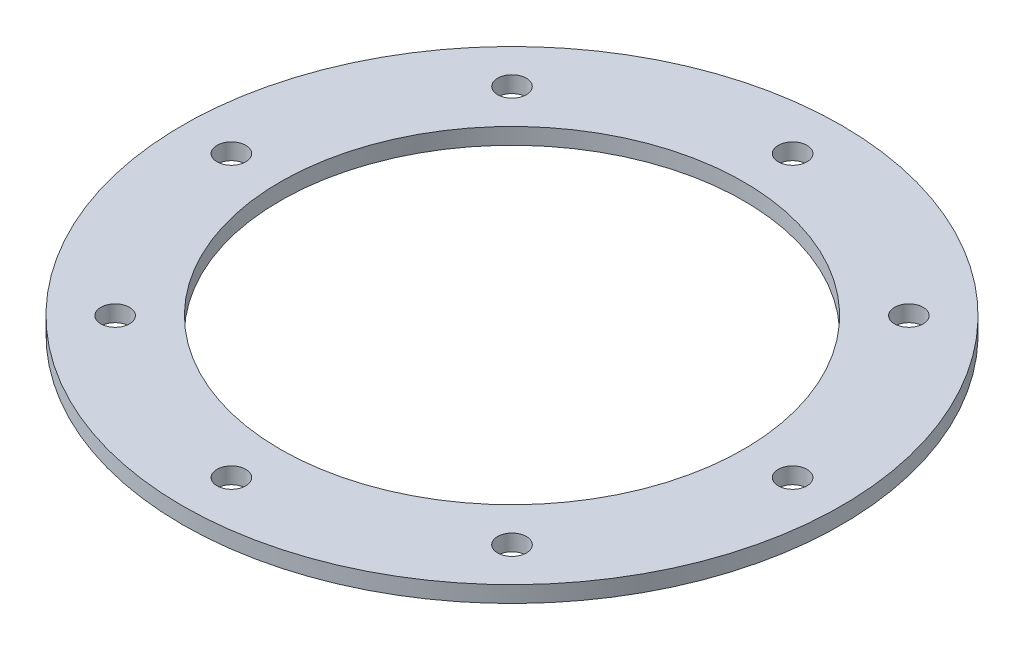
ISO-10303-21;
HEADER;
FILE_DESCRIPTION(('STEP AP214'),'2;1');
FILE_NAME('part.step','',(''),(''),'','','');
FILE_SCHEMA(('AUTOMOTIVE_DESIGN { 1 0 10303 214 1 1 1 1 }'));
ENDSEC;
DATA;
#1=APPLICATION_CONTEXT('core data for automotive mechanical design processes');
#2=APPLICATION_PROTOCOL_DEFINITION('international standard','automotive_design',2000,#1);
#3=PRODUCT_CONTEXT('',#1,'mechanical');
#4=PRODUCT('Part','Part','',(#3));
#5=PRODUCT_RELATED_PRODUCT_CATEGORY('part','',(#4));
#6=PRODUCT_DEFINITION_FORMATION('','',#4);
#7=PRODUCT_DEFINITION_CONTEXT('part definition',#1,'design');
#8=PRODUCT_DEFINITION('design','',#6,#7);
#9=PRODUCT_DEFINITION_SHAPE('','',#8);
#10=(LENGTH_UNIT() NAMED_UNIT(*) SI_UNIT(.MILLI.,.METRE.));
#11=(NAMED_UNIT(*) PLANE_ANGLE_UNIT() SI_UNIT($,.RADIAN.));
#12=(NAMED_UNIT(*) SI_UNIT($,.STERADIAN.) SOLID_ANGLE_UNIT());
#13=UNCERTAINTY_MEASURE_WITH_UNIT(LENGTH_MEASURE(1.E-05),#10,'distance_accuracy_value','');
#14=(GEOMETRIC_REPRESENTATION_CONTEXT(3) GLOBAL_UNCERTAINTY_ASSIGNED_CONTEXT((#13)) GLOBAL_UNIT_ASSIGNED_CONTEXT((#10,
#11,#12)) REPRESENTATION_CONTEXT('',''));
#15=CARTESIAN_POINT('',(0.,0.,0.));
#16=DIRECTION('',(0.,0.,1.));
#17=DIRECTION('',(1.,0.,0.));
#18=AXIS2_PLACEMENT_3D('',#15,#16,#17);
#19=CARTESIAN_POINT('',(0.,5.,0.));
#20=DIRECTION('',(0.,1.,0.));
#21=DIRECTION('',(0.,0.,1.));
#22=AXIS2_PLACEMENT_3D('',#19,#20,#21);
#23=PLANE('',#22);
#24=CARTESIAN_POINT('',(0.,5.,-86.));
#25=DIRECTION('',(0.,1.,0.));
#26=DIRECTION('',(0.,0.,1.));
#27=AXIS2_PLACEMENT_3D('',#24,#25,#26);
#28=CIRCLE('',#27,4.4);
#29=CARTESIAN_POINT('',(0.,5.,-81.6));
#30=VERTEX_POINT('',#29);
#31=EDGE_CURVE('E92',#30,#30,#28,.T.);
#32=ORIENTED_EDGE('',*,*,#31,.F.);
#33=EDGE_LOOP('',(#32));
#34=FACE_BOUND('',#33,.T.);
#35=CARTESIAN_POINT('',(-86.,5.,0.));
#36=DIRECTION('',(0.,1.,0.));
#37=DIRECTION('',(0.,0.,1.));
#38=AXIS2_PLACEMENT_3D('',#35,#36,#37);
#39=CIRCLE('',#38,4.4);
#40=CARTESIAN_POINT('',(-86.,5.,4.39999999999999));
#41=VERTEX_POINT('',#40);
#42=EDGE_CURVE('E79',#41,#41,#39,.T.);
#43=ORIENTED_EDGE('',*,*,#42,.F.);
#44=EDGE_LOOP('',(#43));
#45=FACE_BOUND('',#44,.T.);
#46=CARTESIAN_POINT('',(0.,5.,86.));
#47=DIRECTION('',(0.,1.,0.));
#48=DIRECTION('',(0.,0.,1.));
#49=AXIS2_PLACEMENT_3D('',#46,#47,#48);
#50=CIRCLE('',#49,4.4);
#51=CARTESIAN_POINT('',(0.,5.,90.4));
#52=VERTEX_POINT('',#51);
#53=EDGE_CURVE('E70',#52,#52,#50,.T.);
#54=ORIENTED_EDGE('',*,*,#53,.F.);
#55=EDGE_LOOP('',(#54));
#56=FACE_BOUND('',#55,.T.);
#57=CARTESIAN_POINT('',(86.,5.,0.));
#58=DIRECTION('',(0.,1.,0.));
#59=DIRECTION('',(0.,0.,1.));
#60=AXIS2_PLACEMENT_3D('',#57,#58,#59);
#61=CIRCLE('',#60,4.4);
#62=CARTESIAN_POINT('',(86.,5.,4.4));
#63=VERTEX_POINT('',#62);
#64=EDGE_CURVE('E54',#63,#63,#61,.T.);
#65=ORIENTED_EDGE('',*,*,#64,.F.);
#66=EDGE_LOOP('',(#65));
#67=FACE_BOUND('',#66,.T.);
#68=CARTESIAN_POINT('',(0.,5.,0.));
#69=DIRECTION('',(0.,1.,0.));
#70=DIRECTION('',(0.,0.,1.));
#71=AXIS2_PLACEMENT_3D('',#68,#69,#70);
#72=CIRCLE('',#71,101.);
#73=CARTESIAN_POINT('',(0.,5.,101.));
#74=VERTEX_POINT('',#73);
#75=EDGE_CURVE('E10',#74,#74,#72,.T.);
#76=ORIENTED_EDGE('',*,*,#75,.T.);
#77=EDGE_LOOP('',(#76));
#78=FACE_BOUND('',#77,.T.);
#79=CARTESIAN_POINT('',(0.,5.,0.));
#80=DIRECTION('',(0.,1.,0.));
#81=DIRECTION('',(0.,0.,1.));
#82=AXIS2_PLACEMENT_3D('',#79,#80,#81);
#83=CIRCLE('',#82,71.);
#84=CARTESIAN_POINT('',(0.,5.,71.));
#85=VERTEX_POINT('',#84);
#86=EDGE_CURVE('E49',#85,#85,#83,.T.);
#87=ORIENTED_EDGE('',*,*,#86,.F.);
#88=EDGE_LOOP('',(#87));
#89=FACE_BOUND('',#88,.T.);
#90=CARTESIAN_POINT('',(60.8111831820431,5.,60.8111831820431));
#91=DIRECTION('',(0.,1.,0.));
#92=DIRECTION('',(0.,0.,1.));
#93=AXIS2_PLACEMENT_3D('',#90,#91,#92);
#94=CIRCLE('',#93,4.39999999999998);
#95=CARTESIAN_POINT('',(60.8111831820431,5.,65.2111831820431));
#96=VERTEX_POINT('',#95);
#97=EDGE_CURVE('E62',#96,#96,#94,.T.);
#98=ORIENTED_EDGE('',*,*,#97,.F.);
#99=EDGE_LOOP('',(#98));
#100=FACE_BOUND('',#99,.T.);
#101=CARTESIAN_POINT('',(-60.8111831820431,5.,60.8111831820431));
#102=DIRECTION('',(0.,1.,0.));
#103=DIRECTION('',(0.,0.,1.));
#104=AXIS2_PLACEMENT_3D('',#101,#102,#103);
#105=CIRCLE('',#104,4.4);
#106=CARTESIAN_POINT('',(-60.8111831820431,5.,65.2111831820431));
#107=VERTEX_POINT('',#106);
#108=EDGE_CURVE('E74',#107,#107,#105,.T.);
#109=ORIENTED_EDGE('',*,*,#108,.F.);
#110=EDGE_LOOP('',(#109));
#111=FACE_BOUND('',#110,.T.);
#112=CARTESIAN_POINT('',(-60.8111831820431,5.,-60.8111831820431));
#113=DIRECTION('',(0.,1.,0.));
#114=DIRECTION('',(0.,0.,1.));
#115=AXIS2_PLACEMENT_3D('',#112,#113,#114);
#116=CIRCLE('',#115,4.4);
#117=CARTESIAN_POINT('',(-60.8111831820431,5.,-56.4111831820431));
#118=VERTEX_POINT('',#117);
#119=EDGE_CURVE('E83',#118,#118,#116,.T.);
#120=ORIENTED_EDGE('',*,*,#119,.F.);
#121=EDGE_LOOP('',(#120));
#122=FACE_BOUND('',#121,.T.);
#123=CARTESIAN_POINT('',(60.8111831820431,5.,-60.8111831820431));
#124=DIRECTION('',(0.,1.,0.));
#125=DIRECTION('',(0.,0.,1.));
#126=AXIS2_PLACEMENT_3D('',#123,#124,#125);
#127=CIRCLE('',#126,4.4);
#128=CARTESIAN_POINT('',(60.8111831820431,5.,-56.4111831820431));
#129=VERTEX_POINT('',#128);
#130=EDGE_CURVE('E97',#129,#129,#127,.T.);
#131=ORIENTED_EDGE('',*,*,#130,.F.);
#132=EDGE_LOOP('',(#131));
#133=FACE_BOUND('',#132,.T.);
#134=ADVANCED_FACE('F39',(#34,#45,#56,#67,#78,#89,#100,#111,#122,#133),#23,.T.);
#135=CARTESIAN_POINT('',(0.,0.,0.));
#136=DIRECTION('',(0.,1.,0.));
#137=DIRECTION('',(0.,0.,1.));
#138=AXIS2_PLACEMENT_3D('',#135,#136,#137);
#139=PLANE('',#138);
#140=CARTESIAN_POINT('',(0.,0.,0.));
#141=DIRECTION('',(0.,1.,0.));
#142=DIRECTION('',(0.,0.,1.));
#143=AXIS2_PLACEMENT_3D('',#140,#141,#142);
#144=CIRCLE('',#143,101.);
#145=CARTESIAN_POINT('',(0.,0.,101.));
#146=VERTEX_POINT('',#145);
#147=EDGE_CURVE('E43',#146,#146,#144,.T.);
#148=ORIENTED_EDGE('',*,*,#147,.F.);
#149=EDGE_LOOP('',(#148));
#150=FACE_BOUND('',#149,.T.);
#151=CARTESIAN_POINT('',(0.,0.,0.));
#152=DIRECTION('',(0.,1.,0.));
#153=DIRECTION('',(0.,0.,1.));
#154=AXIS2_PLACEMENT_3D('',#151,#152,#153);
#155=CIRCLE('',#154,71.);
#156=CARTESIAN_POINT('',(0.,0.,71.));
#157=VERTEX_POINT('',#156);
#158=EDGE_CURVE('E55',#157,#157,#155,.T.);
#159=ORIENTED_EDGE('',*,*,#158,.T.);
#160=EDGE_LOOP('',(#159));
#161=FACE_BOUND('',#160,.T.);
#162=CARTESIAN_POINT('',(86.,0.,0.));
#163=DIRECTION('',(0.,1.,0.));
#164=DIRECTION('',(0.,0.,1.));
#165=AXIS2_PLACEMENT_3D('',#162,#163,#164);
#166=CIRCLE('',#165,4.4);
#167=CARTESIAN_POINT('',(86.,0.,4.4));
#168=VERTEX_POINT('',#167);
#169=EDGE_CURVE('E59',#168,#168,#166,.T.);
#170=ORIENTED_EDGE('',*,*,#169,.T.);
#171=EDGE_LOOP('',(#170));
#172=FACE_BOUND('',#171,.T.);
#173=CARTESIAN_POINT('',(60.8111831820431,0.,60.8111831820431));
#174=DIRECTION('',(0.,1.,0.));
#175=DIRECTION('',(0.,0.,1.));
#176=AXIS2_PLACEMENT_3D('',#173,#174,#175);
#177=CIRCLE('',#176,4.39999999999998);
#178=CARTESIAN_POINT('',(60.8111831820431,0.,65.2111831820431));
#179=VERTEX_POINT('',#178);
#180=EDGE_CURVE('E61',#179,#179,#177,.T.);
#181=ORIENTED_EDGE('',*,*,#180,.T.);
#182=EDGE_LOOP('',(#181));
#183=FACE_BOUND('',#182,.T.);
#184=CARTESIAN_POINT('',(0.,0.,86.));
#185=DIRECTION('',(0.,1.,0.));
#186=DIRECTION('',(0.,0.,1.));
#187=AXIS2_PLACEMENT_3D('',#184,#185,#186);
#188=CIRCLE('',#187,4.4);
#189=CARTESIAN_POINT('',(0.,0.,90.4));
#190=VERTEX_POINT('',#189);
#191=EDGE_CURVE('E66',#190,#190,#188,.T.);
#192=ORIENTED_EDGE('',*,*,#191,.T.);
#193=EDGE_LOOP('',(#192));
#194=FACE_BOUND('',#193,.T.);
#195=CARTESIAN_POINT('',(-60.8111831820431,0.,60.8111831820431));
#196=DIRECTION('',(0.,1.,0.));
#197=DIRECTION('',(0.,0.,1.));
#198=AXIS2_PLACEMENT_3D('',#195,#196,#197);
#199=CIRCLE('',#198,4.4);
#200=CARTESIAN_POINT('',(-60.8111831820431,0.,65.2111831820431));
#201=VERTEX_POINT('',#200);
#202=EDGE_CURVE('E77',#201,#201,#199,.T.);
#203=ORIENTED_EDGE('',*,*,#202,.T.);
#204=EDGE_LOOP('',(#203));
#205=FACE_BOUND('',#204,.T.);
#206=CARTESIAN_POINT('',(-86.,0.,0.));
#207=DIRECTION('',(0.,1.,0.));
#208=DIRECTION('',(0.,0.,1.));
#209=AXIS2_PLACEMENT_3D('',#206,#207,#208);
#210=CIRCLE('',#209,4.4);
#211=CARTESIAN_POINT('',(-86.,0.,4.39999999999999));
#212=VERTEX_POINT('',#211);
#213=EDGE_CURVE('E85',#212,#212,#210,.T.);
#214=ORIENTED_EDGE('',*,*,#213,.T.);
#215=EDGE_LOOP('',(#214));
#216=FACE_BOUND('',#215,.T.);
#217=CARTESIAN_POINT('',(-60.8111831820431,0.,-60.8111831820431));
#218=DIRECTION('',(0.,1.,0.));
#219=DIRECTION('',(0.,0.,1.));
#220=AXIS2_PLACEMENT_3D('',#217,#218,#219);
#221=CIRCLE('',#220,4.4);
#222=CARTESIAN_POINT('',(-60.8111831820431,0.,-56.4111831820431));
#223=VERTEX_POINT('',#222);
#224=EDGE_CURVE('E88',#223,#223,#221,.T.);
#225=ORIENTED_EDGE('',*,*,#224,.T.);
#226=EDGE_LOOP('',(#225));
#227=FACE_BOUND('',#226,.T.);
#228=CARTESIAN_POINT('',(0.,0.,-86.));
#229=DIRECTION('',(0.,1.,0.));
#230=DIRECTION('',(0.,0.,1.));
#231=AXIS2_PLACEMENT_3D('',#228,#229,#230);
#232=CIRCLE('',#231,4.4);
#233=CARTESIAN_POINT('',(0.,0.,-81.6));
#234=VERTEX_POINT('',#233);
#235=EDGE_CURVE('E91',#234,#234,#232,.T.);
#236=ORIENTED_EDGE('',*,*,#235,.T.);
#237=EDGE_LOOP('',(#236));
#238=FACE_BOUND('',#237,.T.);
#239=CARTESIAN_POINT('',(60.8111831820431,0.,-60.8111831820431));
#240=DIRECTION('',(0.,1.,0.));
#241=DIRECTION('',(0.,0.,1.));
#242=AXIS2_PLACEMENT_3D('',#239,#240,#241);
#243=CIRCLE('',#242,4.4);
#244=CARTESIAN_POINT('',(60.8111831820431,0.,-56.4111831820431));
#245=VERTEX_POINT('',#244);
#246=EDGE_CURVE('E99',#245,#245,#243,.T.);
#247=ORIENTED_EDGE('',*,*,#246,.T.);
#248=EDGE_LOOP('',(#247));
#249=FACE_BOUND('',#248,.T.);
#250=ADVANCED_FACE('F109',(#150,#161,#172,#183,#194,#205,#216,#227,#238,#249),#139,.F.);
#251=CARTESIAN_POINT('',(0.,5.,0.));
#252=DIRECTION('',(0.,-1.,0.));
#253=DIRECTION('',(0.,0.,-1.));
#254=AXIS2_PLACEMENT_3D('',#251,#252,#253);
#255=CYLINDRICAL_SURFACE('',#254,101.);
#256=ORIENTED_EDGE('',*,*,#75,.F.);
#257=EDGE_LOOP('',(#256));
#258=FACE_BOUND('',#257,.T.);
#259=ORIENTED_EDGE('',*,*,#147,.T.);
#260=EDGE_LOOP('',(#259));
#261=FACE_BOUND('',#260,.T.);
#262=ADVANCED_FACE('F41',(#258,#261),#255,.T.);
#263=CARTESIAN_POINT('',(0.,5.,0.));
#264=DIRECTION('',(0.,-1.,0.));
#265=DIRECTION('',(0.,0.,-1.));
#266=AXIS2_PLACEMENT_3D('',#263,#264,#265);
#267=CYLINDRICAL_SURFACE('',#266,71.);
#268=ORIENTED_EDGE('',*,*,#86,.T.);
#269=EDGE_LOOP('',(#268));
#270=FACE_BOUND('',#269,.T.);
#271=ORIENTED_EDGE('',*,*,#158,.F.);
#272=EDGE_LOOP('',(#271));
#273=FACE_BOUND('',#272,.T.);
#274=ADVANCED_FACE('F119',(#270,#273),#267,.F.);
#275=CARTESIAN_POINT('',(86.,5.,0.));
#276=DIRECTION('',(0.,-1.,0.));
#277=DIRECTION('',(0.,0.,-1.));
#278=AXIS2_PLACEMENT_3D('',#275,#276,#277);
#279=CYLINDRICAL_SURFACE('',#278,4.4);
#280=ORIENTED_EDGE('',*,*,#64,.T.);
#281=EDGE_LOOP('',(#280));
#282=FACE_BOUND('',#281,.T.);
#283=ORIENTED_EDGE('',*,*,#169,.F.);
#284=EDGE_LOOP('',(#283));
#285=FACE_BOUND('',#284,.T.);
#286=ADVANCED_FACE('F124',(#282,#285),#279,.F.);
#287=CARTESIAN_POINT('',(60.8111831820431,5.,60.8111831820431));
#288=DIRECTION('',(0.,-1.,0.));
#289=DIRECTION('',(0.,0.,-1.));
#290=AXIS2_PLACEMENT_3D('',#287,#288,#289);
#291=CYLINDRICAL_SURFACE('',#290,4.39999999999998);
#292=ORIENTED_EDGE('',*,*,#97,.T.);
#293=EDGE_LOOP('',(#292));
#294=FACE_BOUND('',#293,.T.);
#295=ORIENTED_EDGE('',*,*,#180,.F.);
#296=EDGE_LOOP('',(#295));
#297=FACE_BOUND('',#296,.T.);
#298=ADVANCED_FACE('F130',(#294,#297),#291,.F.);
#299=CARTESIAN_POINT('',(0.,5.,86.));
#300=DIRECTION('',(0.,-1.,0.));
#301=DIRECTION('',(0.,0.,-1.));
#302=AXIS2_PLACEMENT_3D('',#299,#300,#301);
#303=CYLINDRICAL_SURFACE('',#302,4.4);
#304=ORIENTED_EDGE('',*,*,#53,.T.);
#305=EDGE_LOOP('',(#304));
#306=FACE_BOUND('',#305,.T.);
#307=ORIENTED_EDGE('',*,*,#191,.F.);
#308=EDGE_LOOP('',(#307));
#309=FACE_BOUND('',#308,.T.);
#310=ADVANCED_FACE('F132',(#306,#309),#303,.F.);
#311=CARTESIAN_POINT('',(-60.8111831820431,5.,60.8111831820431));
#312=DIRECTION('',(0.,-1.,0.));
#313=DIRECTION('',(0.,0.,-1.));
#314=AXIS2_PLACEMENT_3D('',#311,#312,#313);
#315=CYLINDRICAL_SURFACE('',#314,4.4);
#316=ORIENTED_EDGE('',*,*,#108,.T.);
#317=EDGE_LOOP('',(#316));
#318=FACE_BOUND('',#317,.T.);
#319=ORIENTED_EDGE('',*,*,#202,.F.);
#320=EDGE_LOOP('',(#319));
#321=FACE_BOUND('',#320,.T.);
#322=ADVANCED_FACE('F131',(#318,#321),#315,.F.);
#323=CARTESIAN_POINT('',(-86.,5.,0.));
#324=DIRECTION('',(0.,-1.,0.));
#325=DIRECTION('',(0.,0.,-1.));
#326=AXIS2_PLACEMENT_3D('',#323,#324,#325);
#327=CYLINDRICAL_SURFACE('',#326,4.4);
#328=ORIENTED_EDGE('',*,*,#42,.T.);
#329=EDGE_LOOP('',(#328));
#330=FACE_BOUND('',#329,.T.);
#331=ORIENTED_EDGE('',*,*,#213,.F.);
#332=EDGE_LOOP('',(#331));
#333=FACE_BOUND('',#332,.T.);
#334=ADVANCED_FACE('F136',(#330,#333),#327,.F.);
#335=CARTESIAN_POINT('',(-60.8111831820431,5.,-60.8111831820431));
#336=DIRECTION('',(0.,-1.,0.));
#337=DIRECTION('',(0.,0.,-1.));
#338=AXIS2_PLACEMENT_3D('',#335,#336,#337);
#339=CYLINDRICAL_SURFACE('',#338,4.4);
#340=ORIENTED_EDGE('',*,*,#119,.T.);
#341=EDGE_LOOP('',(#340));
#342=FACE_BOUND('',#341,.T.);
#343=ORIENTED_EDGE('',*,*,#224,.F.);
#344=EDGE_LOOP('',(#343));
#345=FACE_BOUND('',#344,.T.);
#346=ADVANCED_FACE('F141',(#342,#345),#339,.F.);
#347=CARTESIAN_POINT('',(0.,5.,-86.));
#348=DIRECTION('',(0.,-1.,0.));
#349=DIRECTION('',(0.,0.,-1.));
#350=AXIS2_PLACEMENT_3D('',#347,#348,#349);
#351=CYLINDRICAL_SURFACE('',#350,4.4);
#352=ORIENTED_EDGE('',*,*,#31,.T.);
#353=EDGE_LOOP('',(#352));
#354=FACE_BOUND('',#353,.T.);
#355=ORIENTED_EDGE('',*,*,#235,.F.);
#356=EDGE_LOOP('',(#355));
#357=FACE_BOUND('',#356,.T.);
#358=ADVANCED_FACE('F150',(#354,#357),#351,.F.);
#359=CARTESIAN_POINT('',(60.8111831820431,5.,-60.8111831820431));
#360=DIRECTION('',(0.,-1.,0.));
#361=DIRECTION('',(0.,0.,-1.));
#362=AXIS2_PLACEMENT_3D('',#359,#360,#361);
#363=CYLINDRICAL_SURFACE('',#362,4.4);
#364=ORIENTED_EDGE('',*,*,#130,.T.);
#365=EDGE_LOOP('',(#364));
#366=FACE_BOUND('',#365,.T.);
#367=ORIENTED_EDGE('',*,*,#246,.F.);
#368=EDGE_LOOP('',(#367));
#369=FACE_BOUND('',#368,.T.);
#370=ADVANCED_FACE('F106',(#366,#369),#363,.F.);
#371=CLOSED_SHELL('',(#134,#250,#262,#274,#286,#298,#310,#322,#334,#346,#358,#370));
#372=MANIFOLD_SOLID_BREP('B2',#371);
#373=ADVANCED_BREP_SHAPE_REPRESENTATION('',(#18,#372),#14);
#374=SHAPE_DEFINITION_REPRESENTATION(#9,#373);
ENDSEC;
END-ISO-10303-21;
